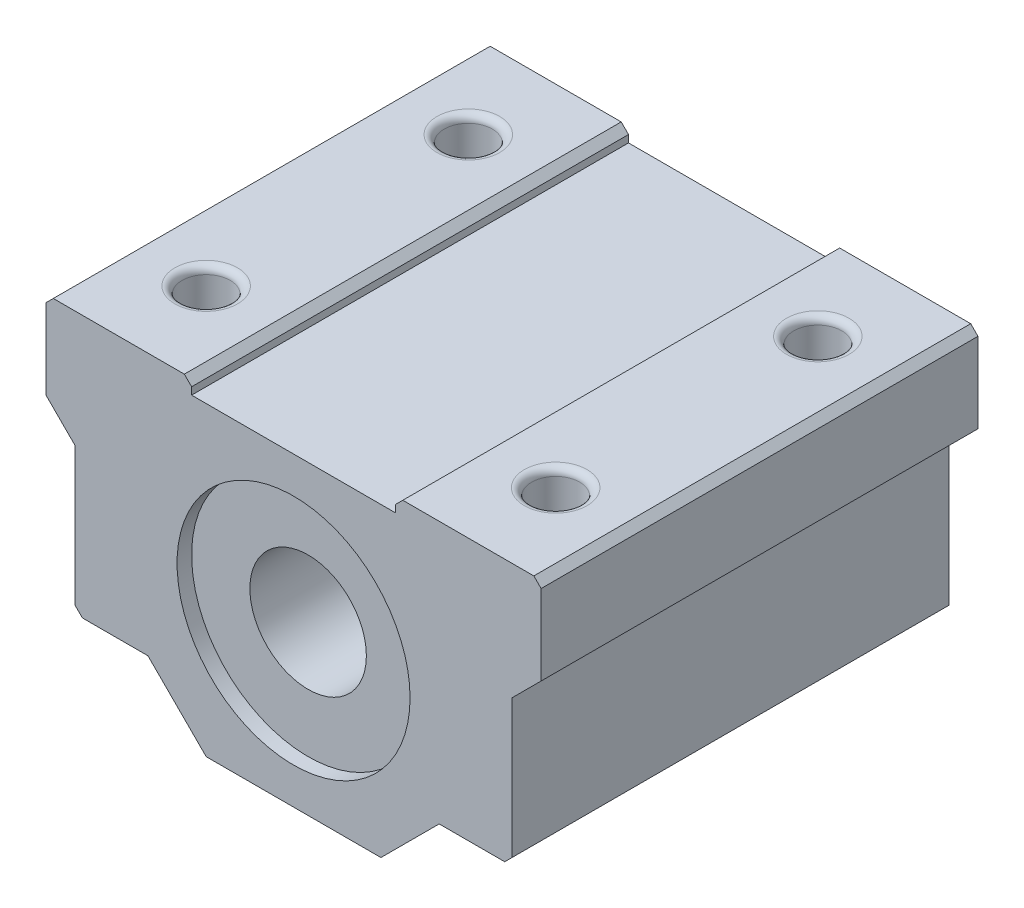
ISO-10303-21;
HEADER;
FILE_DESCRIPTION(('STEP AP214'),'2;1');
FILE_NAME('part.step','',(''),(''),'','','');
FILE_SCHEMA(('AUTOMOTIVE_DESIGN { 1 0 10303 214 1 1 1 1 }'));
ENDSEC;
DATA;
#1=APPLICATION_CONTEXT('core data for automotive mechanical design processes');
#2=APPLICATION_PROTOCOL_DEFINITION('international standard','automotive_design',2000,#1);
#3=PRODUCT_CONTEXT('',#1,'mechanical');
#4=PRODUCT('Part','Part','',(#3));
#5=PRODUCT_RELATED_PRODUCT_CATEGORY('part','',(#4));
#6=PRODUCT_DEFINITION_FORMATION('','',#4);
#7=PRODUCT_DEFINITION_CONTEXT('part definition',#1,'design');
#8=PRODUCT_DEFINITION('design','',#6,#7);
#9=PRODUCT_DEFINITION_SHAPE('','',#8);
#10=(LENGTH_UNIT() NAMED_UNIT(*) SI_UNIT(.MILLI.,.METRE.));
#11=(NAMED_UNIT(*) PLANE_ANGLE_UNIT() SI_UNIT($,.RADIAN.));
#12=(NAMED_UNIT(*) SI_UNIT($,.STERADIAN.) SOLID_ANGLE_UNIT());
#13=UNCERTAINTY_MEASURE_WITH_UNIT(LENGTH_MEASURE(1.E-05),#10,'distance_accuracy_value','');
#14=(GEOMETRIC_REPRESENTATION_CONTEXT(3) GLOBAL_UNCERTAINTY_ASSIGNED_CONTEXT((#13)) GLOBAL_UNIT_ASSIGNED_CONTEXT((#10,
#11,#12)) REPRESENTATION_CONTEXT('',''));
#15=CARTESIAN_POINT('',(0.,0.,0.));
#16=DIRECTION('',(0.,0.,1.));
#17=DIRECTION('',(1.,0.,0.));
#18=AXIS2_PLACEMENT_3D('',#15,#16,#17);
#19=CARTESIAN_POINT('',(0.,0.,15.));
#20=DIRECTION('',(0.,0.,-1.));
#21=DIRECTION('',(-1.,0.,0.));
#22=AXIS2_PLACEMENT_3D('',#19,#20,#21);
#23=CYLINDRICAL_SURFACE('',#22,8.);
#24=CARTESIAN_POINT('',(0.,0.,-15.));
#25=DIRECTION('',(0.,0.,1.));
#26=DIRECTION('',(1.,0.,0.));
#27=AXIS2_PLACEMENT_3D('',#24,#25,#26);
#28=CIRCLE('',#27,8.);
#29=CARTESIAN_POINT('',(8.,0.,-15.));
#30=VERTEX_POINT('',#29);
#31=EDGE_CURVE('E438',#30,#30,#28,.T.);
#32=ORIENTED_EDGE('',*,*,#31,.F.);
#33=EDGE_LOOP('',(#32));
#34=FACE_BOUND('',#33,.T.);
#35=CARTESIAN_POINT('',(0.,0.,-14.));
#36=DIRECTION('',(0.,0.,1.));
#37=DIRECTION('',(1.,0.,0.));
#38=AXIS2_PLACEMENT_3D('',#35,#36,#37);
#39=CIRCLE('',#38,8.);
#40=CARTESIAN_POINT('',(8.,0.,-14.));
#41=VERTEX_POINT('',#40);
#42=EDGE_CURVE('E775',#41,#41,#39,.T.);
#43=ORIENTED_EDGE('',*,*,#42,.T.);
#44=EDGE_LOOP('',(#43));
#45=FACE_BOUND('',#44,.T.);
#46=ADVANCED_FACE('F47',(#34,#45),#23,.F.);
#47=CARTESIAN_POINT('',(0.,0.,15.));
#48=DIRECTION('',(0.,0.,-1.));
#49=DIRECTION('',(-1.,0.,0.));
#50=AXIS2_PLACEMENT_3D('',#47,#48,#49);
#51=PLANE('',#50);
#52=DIRECTION('',(1.,0.,0.));
#53=VECTOR('',#52,1.);
#54=CARTESIAN_POINT('',(10.,-6.5,15.));
#55=LINE('',#54,#53);
#56=CARTESIAN_POINT('',(10.,-6.5,15.));
#57=VERTEX_POINT('',#56);
#58=CARTESIAN_POINT('',(14.5,-6.5,15.));
#59=VERTEX_POINT('',#58);
#60=EDGE_CURVE('E456',#57,#59,#55,.T.);
#61=ORIENTED_EDGE('',*,*,#60,.T.);
#62=DIRECTION('',(-0.707106781186548,-0.707106781186548,0.));
#63=VECTOR('',#62,1.);
#64=CARTESIAN_POINT('',(15.,-6.,15.));
#65=LINE('',#64,#63);
#66=CARTESIAN_POINT('',(15.,-6.,15.));
#67=VERTEX_POINT('',#66);
#68=EDGE_CURVE('E281',#59,#67,#65,.F.);
#69=ORIENTED_EDGE('',*,*,#68,.T.);
#70=DIRECTION('',(0.,1.,0.));
#71=VECTOR('',#70,1.);
#72=CARTESIAN_POINT('',(15.,-6.5,15.));
#73=LINE('',#72,#71);
#74=CARTESIAN_POINT('',(15.,3.5,15.));
#75=VERTEX_POINT('',#74);
#76=EDGE_CURVE('E458',#67,#75,#73,.T.);
#77=ORIENTED_EDGE('',*,*,#76,.T.);
#78=DIRECTION('',(0.707106781186547,0.707106781186547,0.));
#79=VECTOR('',#78,1.);
#80=CARTESIAN_POINT('',(15.,3.5,15.));
#81=LINE('',#80,#79);
#82=CARTESIAN_POINT('',(17.,5.5,15.));
#83=VERTEX_POINT('',#82);
#84=EDGE_CURVE('E460',#75,#83,#81,.T.);
#85=ORIENTED_EDGE('',*,*,#84,.T.);
#86=DIRECTION('',(0.,1.,0.));
#87=VECTOR('',#86,1.);
#88=CARTESIAN_POINT('',(17.,5.5,15.));
#89=LINE('',#88,#87);
#90=CARTESIAN_POINT('',(17.,11.,15.));
#91=VERTEX_POINT('',#90);
#92=EDGE_CURVE('E317',#83,#91,#89,.T.);
#93=ORIENTED_EDGE('',*,*,#92,.T.);
#94=DIRECTION('',(0.707106781186543,-0.707106781186552,0.));
#95=VECTOR('',#94,1.);
#96=CARTESIAN_POINT('',(16.5,11.5,15.));
#97=LINE('',#96,#95);
#98=CARTESIAN_POINT('',(16.5,11.5,15.));
#99=VERTEX_POINT('',#98);
#100=EDGE_CURVE('E273',#91,#99,#97,.F.);
#101=ORIENTED_EDGE('',*,*,#100,.T.);
#102=DIRECTION('',(-1.,0.,0.));
#103=VECTOR('',#102,1.);
#104=CARTESIAN_POINT('',(7.,11.5,15.));
#105=LINE('',#104,#103);
#106=CARTESIAN_POINT('',(7.5,11.5,15.));
#107=VERTEX_POINT('',#106);
#108=EDGE_CURVE('E307',#99,#107,#105,.T.);
#109=ORIENTED_EDGE('',*,*,#108,.T.);
#110=DIRECTION('',(0.707106781186548,0.707106781186548,0.));
#111=VECTOR('',#110,1.);
#112=CARTESIAN_POINT('',(7.,11.,15.));
#113=LINE('',#112,#111);
#114=CARTESIAN_POINT('',(7.,11.,15.));
#115=VERTEX_POINT('',#114);
#116=EDGE_CURVE('E275',#107,#115,#113,.F.);
#117=ORIENTED_EDGE('',*,*,#116,.T.);
#118=DIRECTION('',(0.,-1.,0.));
#119=VECTOR('',#118,1.);
#120=CARTESIAN_POINT('',(7.,10.5,15.));
#121=LINE('',#120,#119);
#122=CARTESIAN_POINT('',(7.,10.5,15.));
#123=VERTEX_POINT('',#122);
#124=EDGE_CURVE('E316',#115,#123,#121,.T.);
#125=ORIENTED_EDGE('',*,*,#124,.T.);
#126=DIRECTION('',(-1.,0.,0.));
#127=VECTOR('',#126,1.);
#128=CARTESIAN_POINT('',(-7.,10.5,15.));
#129=LINE('',#128,#127);
#130=CARTESIAN_POINT('',(-7.,10.5,15.));
#131=VERTEX_POINT('',#130);
#132=EDGE_CURVE('E464',#123,#131,#129,.T.);
#133=ORIENTED_EDGE('',*,*,#132,.T.);
#134=DIRECTION('',(0.,1.,0.));
#135=VECTOR('',#134,1.);
#136=CARTESIAN_POINT('',(-7.,10.5,15.));
#137=LINE('',#136,#135);
#138=CARTESIAN_POINT('',(-7.,11.,15.));
#139=VERTEX_POINT('',#138);
#140=EDGE_CURVE('E466',#131,#139,#137,.T.);
#141=ORIENTED_EDGE('',*,*,#140,.T.);
#142=DIRECTION('',(0.707106781186548,-0.707106781186548,0.));
#143=VECTOR('',#142,1.);
#144=CARTESIAN_POINT('',(-7.5,11.5,15.));
#145=LINE('',#144,#143);
#146=CARTESIAN_POINT('',(-7.5,11.5,15.));
#147=VERTEX_POINT('',#146);
#148=EDGE_CURVE('E69',#139,#147,#145,.F.);
#149=ORIENTED_EDGE('',*,*,#148,.T.);
#150=DIRECTION('',(-1.,0.,0.));
#151=VECTOR('',#150,1.);
#152=CARTESIAN_POINT('',(-17.,11.5,15.));
#153=LINE('',#152,#151);
#154=CARTESIAN_POINT('',(-16.5,11.5,15.));
#155=VERTEX_POINT('',#154);
#156=EDGE_CURVE('E348',#147,#155,#153,.T.);
#157=ORIENTED_EDGE('',*,*,#156,.T.);
#158=DIRECTION('',(0.707106781186548,0.707106781186548,0.));
#159=VECTOR('',#158,1.);
#160=CARTESIAN_POINT('',(-17.,11.,15.));
#161=LINE('',#160,#159);
#162=CARTESIAN_POINT('',(-17.,11.,15.));
#163=VERTEX_POINT('',#162);
#164=EDGE_CURVE('E204',#155,#163,#161,.F.);
#165=ORIENTED_EDGE('',*,*,#164,.T.);
#166=DIRECTION('',(0.,-1.,0.));
#167=VECTOR('',#166,1.);
#168=CARTESIAN_POINT('',(-17.,5.5,15.));
#169=LINE('',#168,#167);
#170=CARTESIAN_POINT('',(-17.,5.5,15.));
#171=VERTEX_POINT('',#170);
#172=EDGE_CURVE('E195',#163,#171,#169,.T.);
#173=ORIENTED_EDGE('',*,*,#172,.T.);
#174=DIRECTION('',(0.707106781186547,-0.707106781186547,0.));
#175=VECTOR('',#174,1.);
#176=CARTESIAN_POINT('',(-15.,3.5,15.));
#177=LINE('',#176,#175);
#178=CARTESIAN_POINT('',(-15.,3.5,15.));
#179=VERTEX_POINT('',#178);
#180=EDGE_CURVE('E201',#171,#179,#177,.T.);
#181=ORIENTED_EDGE('',*,*,#180,.T.);
#182=DIRECTION('',(0.,-1.,0.));
#183=VECTOR('',#182,1.);
#184=CARTESIAN_POINT('',(-15.,-6.5,15.));
#185=LINE('',#184,#183);
#186=CARTESIAN_POINT('',(-15.,-6.,15.));
#187=VERTEX_POINT('',#186);
#188=EDGE_CURVE('E218',#179,#187,#185,.T.);
#189=ORIENTED_EDGE('',*,*,#188,.T.);
#190=DIRECTION('',(-0.707106781186548,0.707106781186548,0.));
#191=VECTOR('',#190,1.);
#192=CARTESIAN_POINT('',(-14.5,-6.5,15.));
#193=LINE('',#192,#191);
#194=CARTESIAN_POINT('',(-14.5,-6.5,15.));
#195=VERTEX_POINT('',#194);
#196=EDGE_CURVE('E279',#187,#195,#193,.F.);
#197=ORIENTED_EDGE('',*,*,#196,.T.);
#198=DIRECTION('',(1.,0.,0.));
#199=VECTOR('',#198,1.);
#200=CARTESIAN_POINT('',(-10.,-6.5,15.));
#201=LINE('',#200,#199);
#202=CARTESIAN_POINT('',(-10.,-6.5,15.));
#203=VERTEX_POINT('',#202);
#204=EDGE_CURVE('E449',#195,#203,#201,.T.);
#205=ORIENTED_EDGE('',*,*,#204,.T.);
#206=DIRECTION('',(0.707106781186548,-0.707106781186548,0.));
#207=VECTOR('',#206,1.);
#208=CARTESIAN_POINT('',(-6.,-10.5,15.));
#209=LINE('',#208,#207);
#210=CARTESIAN_POINT('',(-6.,-10.5,15.));
#211=VERTEX_POINT('',#210);
#212=EDGE_CURVE('E372',#203,#211,#209,.T.);
#213=ORIENTED_EDGE('',*,*,#212,.T.);
#214=DIRECTION('',(1.,0.,0.));
#215=VECTOR('',#214,1.);
#216=CARTESIAN_POINT('',(-6.,-10.5,15.));
#217=LINE('',#216,#215);
#218=CARTESIAN_POINT('',(6.,-10.5,15.));
#219=VERTEX_POINT('',#218);
#220=EDGE_CURVE('E452',#211,#219,#217,.T.);
#221=ORIENTED_EDGE('',*,*,#220,.T.);
#222=DIRECTION('',(0.707106781186548,0.707106781186547,0.));
#223=VECTOR('',#222,1.);
#224=CARTESIAN_POINT('',(6.,-10.5,15.));
#225=LINE('',#224,#223);
#226=EDGE_CURVE('E454',#219,#57,#225,.T.);
#227=ORIENTED_EDGE('',*,*,#226,.T.);
#228=EDGE_LOOP('',(#61,#69,#77,#85,#93,#101,#109,#117,#125,#133,#141,#149,#157,#165,#173,#181,
#189,#197,#205,#213,#221,#227));
#229=FACE_BOUND('',#228,.T.);
#230=CARTESIAN_POINT('',(0.,0.,15.));
#231=DIRECTION('',(0.,0.,1.));
#232=DIRECTION('',(1.,0.,0.));
#233=AXIS2_PLACEMENT_3D('',#230,#231,#232);
#234=CIRCLE('',#233,8.);
#235=CARTESIAN_POINT('',(8.,0.,15.));
#236=VERTEX_POINT('',#235);
#237=EDGE_CURVE('E437',#236,#236,#234,.T.);
#238=ORIENTED_EDGE('',*,*,#237,.F.);
#239=EDGE_LOOP('',(#238));
#240=FACE_BOUND('',#239,.T.);
#241=ADVANCED_FACE('F198',(#229,#240),#51,.F.);
#242=CARTESIAN_POINT('',(0.,0.,-15.));
#243=DIRECTION('',(0.,0.,-1.));
#244=DIRECTION('',(-1.,0.,0.));
#245=AXIS2_PLACEMENT_3D('',#242,#243,#244);
#246=PLANE('',#245);
#247=DIRECTION('',(0.,1.,0.));
#248=VECTOR('',#247,1.);
#249=CARTESIAN_POINT('',(15.,-6.5,-15.));
#250=LINE('',#249,#248);
#251=CARTESIAN_POINT('',(15.,-6.,-15.));
#252=VERTEX_POINT('',#251);
#253=CARTESIAN_POINT('',(15.,3.5,-15.));
#254=VERTEX_POINT('',#253);
#255=EDGE_CURVE('E391',#252,#254,#250,.T.);
#256=ORIENTED_EDGE('',*,*,#255,.F.);
#257=DIRECTION('',(0.707106781186548,0.707106781186548,0.));
#258=VECTOR('',#257,1.);
#259=CARTESIAN_POINT('',(10.5,-10.5,-15.));
#260=LINE('',#259,#258);
#261=CARTESIAN_POINT('',(14.5,-6.5,-15.));
#262=VERTEX_POINT('',#261);
#263=EDGE_CURVE('E269',#252,#262,#260,.F.);
#264=ORIENTED_EDGE('',*,*,#263,.T.);
#265=DIRECTION('',(1.,0.,0.));
#266=VECTOR('',#265,1.);
#267=CARTESIAN_POINT('',(10.,-6.5,-15.));
#268=LINE('',#267,#266);
#269=CARTESIAN_POINT('',(10.,-6.5,-15.));
#270=VERTEX_POINT('',#269);
#271=EDGE_CURVE('E388',#270,#262,#268,.T.);
#272=ORIENTED_EDGE('',*,*,#271,.F.);
#273=DIRECTION('',(0.707106781186548,0.707106781186547,0.));
#274=VECTOR('',#273,1.);
#275=CARTESIAN_POINT('',(6.,-10.5,-15.));
#276=LINE('',#275,#274);
#277=CARTESIAN_POINT('',(6.,-10.5,-15.));
#278=VERTEX_POINT('',#277);
#279=EDGE_CURVE('E381',#278,#270,#276,.T.);
#280=ORIENTED_EDGE('',*,*,#279,.F.);
#281=DIRECTION('',(1.,0.,0.));
#282=VECTOR('',#281,1.);
#283=CARTESIAN_POINT('',(-6.,-10.5,-15.));
#284=LINE('',#283,#282);
#285=CARTESIAN_POINT('',(-6.,-10.5,-15.));
#286=VERTEX_POINT('',#285);
#287=EDGE_CURVE('E379',#286,#278,#284,.T.);
#288=ORIENTED_EDGE('',*,*,#287,.F.);
#289=DIRECTION('',(0.707106781186548,-0.707106781186548,0.));
#290=VECTOR('',#289,1.);
#291=CARTESIAN_POINT('',(-6.,-10.5,-15.));
#292=LINE('',#291,#290);
#293=CARTESIAN_POINT('',(-10.,-6.5,-15.));
#294=VERTEX_POINT('',#293);
#295=EDGE_CURVE('E371',#294,#286,#292,.T.);
#296=ORIENTED_EDGE('',*,*,#295,.F.);
#297=DIRECTION('',(1.,0.,0.));
#298=VECTOR('',#297,1.);
#299=CARTESIAN_POINT('',(-10.,-6.5,-15.));
#300=LINE('',#299,#298);
#301=CARTESIAN_POINT('',(-14.5,-6.5,-15.));
#302=VERTEX_POINT('',#301);
#303=EDGE_CURVE('E377',#302,#294,#300,.T.);
#304=ORIENTED_EDGE('',*,*,#303,.F.);
#305=DIRECTION('',(0.707106781186548,-0.707106781186548,0.));
#306=VECTOR('',#305,1.);
#307=CARTESIAN_POINT('',(-10.5,-10.5,-15.));
#308=LINE('',#307,#306);
#309=CARTESIAN_POINT('',(-15.,-6.,-15.));
#310=VERTEX_POINT('',#309);
#311=EDGE_CURVE('E267',#302,#310,#308,.F.);
#312=ORIENTED_EDGE('',*,*,#311,.T.);
#313=DIRECTION('',(0.,-1.,0.));
#314=VECTOR('',#313,1.);
#315=CARTESIAN_POINT('',(-15.,-6.5,-15.));
#316=LINE('',#315,#314);
#317=CARTESIAN_POINT('',(-15.,3.5,-15.));
#318=VERTEX_POINT('',#317);
#319=EDGE_CURVE('E383',#318,#310,#316,.T.);
#320=ORIENTED_EDGE('',*,*,#319,.F.);
#321=DIRECTION('',(0.707106781186547,-0.707106781186547,0.));
#322=VECTOR('',#321,1.);
#323=CARTESIAN_POINT('',(-15.,3.5,-15.));
#324=LINE('',#323,#322);
#325=CARTESIAN_POINT('',(-17.,5.5,-15.));
#326=VERTEX_POINT('',#325);
#327=EDGE_CURVE('E440',#326,#318,#324,.T.);
#328=ORIENTED_EDGE('',*,*,#327,.F.);
#329=DIRECTION('',(0.,-1.,0.));
#330=VECTOR('',#329,1.);
#331=CARTESIAN_POINT('',(-17.,5.5,-15.));
#332=LINE('',#331,#330);
#333=CARTESIAN_POINT('',(-17.,11.,-15.));
#334=VERTEX_POINT('',#333);
#335=EDGE_CURVE('E222',#334,#326,#332,.T.);
#336=ORIENTED_EDGE('',*,*,#335,.F.);
#337=DIRECTION('',(-0.707106781186548,-0.707106781186548,0.));
#338=VECTOR('',#337,1.);
#339=CARTESIAN_POINT('',(-14.,14.,-15.));
#340=LINE('',#339,#338);
#341=CARTESIAN_POINT('',(-16.5,11.5,-15.));
#342=VERTEX_POINT('',#341);
#343=EDGE_CURVE('E265',#334,#342,#340,.F.);
#344=ORIENTED_EDGE('',*,*,#343,.T.);
#345=DIRECTION('',(-1.,0.,0.));
#346=VECTOR('',#345,1.);
#347=CARTESIAN_POINT('',(-17.,11.5,-15.));
#348=LINE('',#347,#346);
#349=CARTESIAN_POINT('',(-7.5,11.5,-15.));
#350=VERTEX_POINT('',#349);
#351=EDGE_CURVE('E209',#350,#342,#348,.T.);
#352=ORIENTED_EDGE('',*,*,#351,.F.);
#353=DIRECTION('',(-0.707106781186548,0.707106781186548,0.));
#354=VECTOR('',#353,1.);
#355=CARTESIAN_POINT('',(2.,2.,-15.));
#356=LINE('',#355,#354);
#357=CARTESIAN_POINT('',(-7.,11.,-15.));
#358=VERTEX_POINT('',#357);
#359=EDGE_CURVE('E263',#350,#358,#356,.F.);
#360=ORIENTED_EDGE('',*,*,#359,.T.);
#361=DIRECTION('',(0.,1.,0.));
#362=VECTOR('',#361,1.);
#363=CARTESIAN_POINT('',(-7.,10.5,-15.));
#364=LINE('',#363,#362);
#365=CARTESIAN_POINT('',(-7.,10.5,-15.));
#366=VERTEX_POINT('',#365);
#367=EDGE_CURVE('E335',#366,#358,#364,.T.);
#368=ORIENTED_EDGE('',*,*,#367,.F.);
#369=DIRECTION('',(-1.,0.,0.));
#370=VECTOR('',#369,1.);
#371=CARTESIAN_POINT('',(-7.,10.5,-15.));
#372=LINE('',#371,#370);
#373=CARTESIAN_POINT('',(7.,10.5,-15.));
#374=VERTEX_POINT('',#373);
#375=EDGE_CURVE('E333',#374,#366,#372,.T.);
#376=ORIENTED_EDGE('',*,*,#375,.F.);
#377=DIRECTION('',(0.,-1.,0.));
#378=VECTOR('',#377,1.);
#379=CARTESIAN_POINT('',(7.,10.5,-15.));
#380=LINE('',#379,#378);
#381=CARTESIAN_POINT('',(7.,11.,-15.));
#382=VERTEX_POINT('',#381);
#383=EDGE_CURVE('E325',#382,#374,#380,.T.);
#384=ORIENTED_EDGE('',*,*,#383,.F.);
#385=DIRECTION('',(-0.707106781186548,-0.707106781186548,0.));
#386=VECTOR('',#385,1.);
#387=CARTESIAN_POINT('',(-2.,2.,-15.));
#388=LINE('',#387,#386);
#389=CARTESIAN_POINT('',(7.5,11.5,-15.));
#390=VERTEX_POINT('',#389);
#391=EDGE_CURVE('E261',#382,#390,#388,.F.);
#392=ORIENTED_EDGE('',*,*,#391,.T.);
#393=DIRECTION('',(-1.,0.,0.));
#394=VECTOR('',#393,1.);
#395=CARTESIAN_POINT('',(7.,11.5,-15.));
#396=LINE('',#395,#394);
#397=CARTESIAN_POINT('',(16.5,11.5,-15.));
#398=VERTEX_POINT('',#397);
#399=EDGE_CURVE('E310',#398,#390,#396,.T.);
#400=ORIENTED_EDGE('',*,*,#399,.F.);
#401=DIRECTION('',(-0.707106781186543,0.707106781186552,0.));
#402=VECTOR('',#401,1.);
#403=CARTESIAN_POINT('',(14.0000000000001,13.9999999999999,-15.));
#404=LINE('',#403,#402);
#405=CARTESIAN_POINT('',(17.,11.,-15.));
#406=VERTEX_POINT('',#405);
#407=EDGE_CURVE('E259',#398,#406,#404,.F.);
#408=ORIENTED_EDGE('',*,*,#407,.T.);
#409=DIRECTION('',(0.,1.,0.));
#410=VECTOR('',#409,1.);
#411=CARTESIAN_POINT('',(17.,5.5,-15.));
#412=LINE('',#411,#410);
#413=CARTESIAN_POINT('',(17.,5.5,-15.));
#414=VERTEX_POINT('',#413);
#415=EDGE_CURVE('E337',#414,#406,#412,.T.);
#416=ORIENTED_EDGE('',*,*,#415,.F.);
#417=DIRECTION('',(0.707106781186547,0.707106781186547,0.));
#418=VECTOR('',#417,1.);
#419=CARTESIAN_POINT('',(15.,3.5,-15.));
#420=LINE('',#419,#418);
#421=EDGE_CURVE('E393',#254,#414,#420,.T.);
#422=ORIENTED_EDGE('',*,*,#421,.F.);
#423=EDGE_LOOP('',(#256,#264,#272,#280,#288,#296,#304,#312,#320,#328,#336,#344,#352,#360,#368,
#376,#384,#392,#400,#408,#416,#422));
#424=FACE_BOUND('',#423,.T.);
#425=ORIENTED_EDGE('',*,*,#31,.T.);
#426=EDGE_LOOP('',(#425));
#427=FACE_BOUND('',#426,.T.);
#428=ADVANCED_FACE('F330',(#424,#427),#246,.T.);
#429=CARTESIAN_POINT('',(-17.,5.5,15.));
#430=DIRECTION('',(1.,0.,0.));
#431=DIRECTION('',(0.,0.,-1.));
#432=AXIS2_PLACEMENT_3D('',#429,#430,#431);
#433=PLANE('',#432);
#434=ORIENTED_EDGE('',*,*,#172,.F.);
#435=DIRECTION('',(0.,0.,-1.));
#436=VECTOR('',#435,1.);
#437=CARTESIAN_POINT('',(-17.,11.,15.));
#438=LINE('',#437,#436);
#439=EDGE_CURVE('E288',#163,#334,#438,.T.);
#440=ORIENTED_EDGE('',*,*,#439,.T.);
#441=ORIENTED_EDGE('',*,*,#335,.T.);
#442=DIRECTION('',(0.,0.,-1.));
#443=VECTOR('',#442,1.);
#444=CARTESIAN_POINT('',(-17.,5.5,15.));
#445=LINE('',#444,#443);
#446=EDGE_CURVE('E214',#171,#326,#445,.T.);
#447=ORIENTED_EDGE('',*,*,#446,.F.);
#448=EDGE_LOOP('',(#434,#440,#441,#447));
#449=FACE_BOUND('',#448,.T.);
#450=ADVANCED_FACE('F220',(#449),#433,.F.);
#451=CARTESIAN_POINT('',(-15.,3.5,15.));
#452=DIRECTION('',(0.707106781186547,0.707106781186547,0.));
#453=DIRECTION('',(-0.707106781186548,0.707106781186548,0.));
#454=AXIS2_PLACEMENT_3D('',#451,#452,#453);
#455=PLANE('',#454);
#456=ORIENTED_EDGE('',*,*,#327,.T.);
#457=DIRECTION('',(0.,0.,-1.));
#458=VECTOR('',#457,1.);
#459=CARTESIAN_POINT('',(-15.,3.5,15.));
#460=LINE('',#459,#458);
#461=EDGE_CURVE('E216',#179,#318,#460,.T.);
#462=ORIENTED_EDGE('',*,*,#461,.F.);
#463=ORIENTED_EDGE('',*,*,#180,.F.);
#464=ORIENTED_EDGE('',*,*,#446,.T.);
#465=EDGE_LOOP('',(#456,#462,#463,#464));
#466=FACE_BOUND('',#465,.T.);
#467=ADVANCED_FACE('F213',(#466),#455,.F.);
#468=CARTESIAN_POINT('',(-15.,-6.5,15.));
#469=DIRECTION('',(1.,0.,0.));
#470=DIRECTION('',(0.,0.,-1.));
#471=AXIS2_PLACEMENT_3D('',#468,#469,#470);
#472=PLANE('',#471);
#473=ORIENTED_EDGE('',*,*,#319,.T.);
#474=DIRECTION('',(0.,0.,1.));
#475=VECTOR('',#474,1.);
#476=CARTESIAN_POINT('',(-15.,-6.,15.));
#477=LINE('',#476,#475);
#478=EDGE_CURVE('E286',#310,#187,#477,.T.);
#479=ORIENTED_EDGE('',*,*,#478,.T.);
#480=ORIENTED_EDGE('',*,*,#188,.F.);
#481=ORIENTED_EDGE('',*,*,#461,.T.);
#482=EDGE_LOOP('',(#473,#479,#480,#481));
#483=FACE_BOUND('',#482,.T.);
#484=ADVANCED_FACE('F473',(#483),#472,.F.);
#485=CARTESIAN_POINT('',(-10.,-6.5,15.));
#486=DIRECTION('',(0.,1.,0.));
#487=DIRECTION('',(0.,0.,1.));
#488=AXIS2_PLACEMENT_3D('',#485,#486,#487);
#489=PLANE('',#488);
#490=CARTESIAN_POINT('',(-12.,-6.5,9.));
#491=DIRECTION('',(0.,1.,0.));
#492=DIRECTION('',(0.,0.,1.));
#493=AXIS2_PLACEMENT_3D('',#490,#491,#492);
#494=CIRCLE('',#493,1.65);
#495=CARTESIAN_POINT('',(-12.,-6.5,10.65));
#496=VERTEX_POINT('',#495);
#497=EDGE_CURVE('E780',#496,#496,#494,.T.);
#498=ORIENTED_EDGE('',*,*,#497,.T.);
#499=EDGE_LOOP('',(#498));
#500=FACE_BOUND('',#499,.T.);
#501=CARTESIAN_POINT('',(-12.,-6.5,-9.));
#502=DIRECTION('',(0.,1.,0.));
#503=DIRECTION('',(0.,0.,1.));
#504=AXIS2_PLACEMENT_3D('',#501,#502,#503);
#505=CIRCLE('',#504,1.65);
#506=CARTESIAN_POINT('',(-12.,-6.5,-7.35));
#507=VERTEX_POINT('',#506);
#508=EDGE_CURVE('E443',#507,#507,#505,.T.);
#509=ORIENTED_EDGE('',*,*,#508,.T.);
#510=EDGE_LOOP('',(#509));
#511=FACE_BOUND('',#510,.T.);
#512=ORIENTED_EDGE('',*,*,#204,.F.);
#513=DIRECTION('',(0.,0.,-1.));
#514=VECTOR('',#513,1.);
#515=CARTESIAN_POINT('',(-14.5,-6.5,15.));
#516=LINE('',#515,#514);
#517=EDGE_CURVE('E283',#195,#302,#516,.T.);
#518=ORIENTED_EDGE('',*,*,#517,.T.);
#519=ORIENTED_EDGE('',*,*,#303,.T.);
#520=DIRECTION('',(0.,0.,-1.));
#521=VECTOR('',#520,1.);
#522=CARTESIAN_POINT('',(-10.,-6.5,15.));
#523=LINE('',#522,#521);
#524=EDGE_CURVE('E229',#203,#294,#523,.T.);
#525=ORIENTED_EDGE('',*,*,#524,.F.);
#526=EDGE_LOOP('',(#512,#518,#519,#525));
#527=FACE_BOUND('',#526,.T.);
#528=ADVANCED_FACE('F478',(#500,#511,#527),#489,.F.);
#529=CARTESIAN_POINT('',(-6.,-10.5,15.));
#530=DIRECTION('',(0.707106781186548,0.707106781186548,0.));
#531=DIRECTION('',(-0.707106781186548,0.707106781186548,0.));
#532=AXIS2_PLACEMENT_3D('',#529,#530,#531);
#533=PLANE('',#532);
#534=ORIENTED_EDGE('',*,*,#295,.T.);
#535=DIRECTION('',(0.,0.,-1.));
#536=VECTOR('',#535,1.);
#537=CARTESIAN_POINT('',(-6.,-10.5,15.));
#538=LINE('',#537,#536);
#539=EDGE_CURVE('E362',#211,#286,#538,.T.);
#540=ORIENTED_EDGE('',*,*,#539,.F.);
#541=ORIENTED_EDGE('',*,*,#212,.F.);
#542=ORIENTED_EDGE('',*,*,#524,.T.);
#543=EDGE_LOOP('',(#534,#540,#541,#542));
#544=FACE_BOUND('',#543,.T.);
#545=ADVANCED_FACE('F369',(#544),#533,.F.);
#546=CARTESIAN_POINT('',(-6.,-10.5,15.));
#547=DIRECTION('',(0.,1.,0.));
#548=DIRECTION('',(0.,0.,1.));
#549=AXIS2_PLACEMENT_3D('',#546,#547,#548);
#550=PLANE('',#549);
#551=ORIENTED_EDGE('',*,*,#287,.T.);
#552=DIRECTION('',(0.,0.,-1.));
#553=VECTOR('',#552,1.);
#554=CARTESIAN_POINT('',(6.,-10.5,15.));
#555=LINE('',#554,#553);
#556=EDGE_CURVE('E359',#219,#278,#555,.T.);
#557=ORIENTED_EDGE('',*,*,#556,.F.);
#558=ORIENTED_EDGE('',*,*,#220,.F.);
#559=ORIENTED_EDGE('',*,*,#539,.T.);
#560=EDGE_LOOP('',(#551,#557,#558,#559));
#561=FACE_BOUND('',#560,.T.);
#562=ADVANCED_FACE('F487',(#561),#550,.F.);
#563=CARTESIAN_POINT('',(6.,-10.5,15.));
#564=DIRECTION('',(-0.707106781186547,0.707106781186548,0.));
#565=DIRECTION('',(-0.707106781186548,-0.707106781186547,0.));
#566=AXIS2_PLACEMENT_3D('',#563,#564,#565);
#567=PLANE('',#566);
#568=ORIENTED_EDGE('',*,*,#279,.T.);
#569=DIRECTION('',(0.,0.,-1.));
#570=VECTOR('',#569,1.);
#571=CARTESIAN_POINT('',(10.,-6.5,15.));
#572=LINE('',#571,#570);
#573=EDGE_CURVE('E356',#57,#270,#572,.T.);
#574=ORIENTED_EDGE('',*,*,#573,.F.);
#575=ORIENTED_EDGE('',*,*,#226,.F.);
#576=ORIENTED_EDGE('',*,*,#556,.T.);
#577=EDGE_LOOP('',(#568,#574,#575,#576));
#578=FACE_BOUND('',#577,.T.);
#579=ADVANCED_FACE('F563',(#578),#567,.F.);
#580=CARTESIAN_POINT('',(10.,-6.5,15.));
#581=DIRECTION('',(0.,1.,0.));
#582=DIRECTION('',(0.,0.,1.));
#583=AXIS2_PLACEMENT_3D('',#580,#581,#582);
#584=PLANE('',#583);
#585=CARTESIAN_POINT('',(12.,-6.5,9.));
#586=DIRECTION('',(0.,1.,0.));
#587=DIRECTION('',(0.,0.,1.));
#588=AXIS2_PLACEMENT_3D('',#585,#586,#587);
#589=CIRCLE('',#588,1.65);
#590=CARTESIAN_POINT('',(12.,-6.5,10.65));
#591=VERTEX_POINT('',#590);
#592=EDGE_CURVE('E784',#591,#591,#589,.T.);
#593=ORIENTED_EDGE('',*,*,#592,.T.);
#594=EDGE_LOOP('',(#593));
#595=FACE_BOUND('',#594,.T.);
#596=CARTESIAN_POINT('',(12.,-6.5,-9.));
#597=DIRECTION('',(0.,1.,0.));
#598=DIRECTION('',(0.,0.,1.));
#599=AXIS2_PLACEMENT_3D('',#596,#597,#598);
#600=CIRCLE('',#599,1.65);
#601=CARTESIAN_POINT('',(12.,-6.5,-7.35));
#602=VERTEX_POINT('',#601);
#603=EDGE_CURVE('E782',#602,#602,#600,.T.);
#604=ORIENTED_EDGE('',*,*,#603,.T.);
#605=EDGE_LOOP('',(#604));
#606=FACE_BOUND('',#605,.T.);
#607=ORIENTED_EDGE('',*,*,#271,.T.);
#608=DIRECTION('',(0.,0.,1.));
#609=VECTOR('',#608,1.);
#610=CARTESIAN_POINT('',(14.5,-6.5,15.));
#611=LINE('',#610,#609);
#612=EDGE_CURVE('E271',#262,#59,#611,.T.);
#613=ORIENTED_EDGE('',*,*,#612,.T.);
#614=ORIENTED_EDGE('',*,*,#60,.F.);
#615=ORIENTED_EDGE('',*,*,#573,.T.);
#616=EDGE_LOOP('',(#607,#613,#614,#615));
#617=FACE_BOUND('',#616,.T.);
#618=ADVANCED_FACE('F560',(#595,#606,#617),#584,.F.);
#619=CARTESIAN_POINT('',(15.,-6.5,15.));
#620=DIRECTION('',(-1.,0.,0.));
#621=DIRECTION('',(0.,0.,1.));
#622=AXIS2_PLACEMENT_3D('',#619,#620,#621);
#623=PLANE('',#622);
#624=ORIENTED_EDGE('',*,*,#76,.F.);
#625=DIRECTION('',(0.,0.,-1.));
#626=VECTOR('',#625,1.);
#627=CARTESIAN_POINT('',(15.,-6.,15.));
#628=LINE('',#627,#626);
#629=EDGE_CURVE('E256',#67,#252,#628,.T.);
#630=ORIENTED_EDGE('',*,*,#629,.T.);
#631=ORIENTED_EDGE('',*,*,#255,.T.);
#632=DIRECTION('',(0.,0.,-1.));
#633=VECTOR('',#632,1.);
#634=CARTESIAN_POINT('',(15.,3.5,15.));
#635=LINE('',#634,#633);
#636=EDGE_CURVE('E353',#75,#254,#635,.T.);
#637=ORIENTED_EDGE('',*,*,#636,.F.);
#638=EDGE_LOOP('',(#624,#630,#631,#637));
#639=FACE_BOUND('',#638,.T.);
#640=ADVANCED_FACE('F556',(#639),#623,.F.);
#641=CARTESIAN_POINT('',(15.,3.5,15.));
#642=DIRECTION('',(-0.707106781186547,0.707106781186547,0.));
#643=DIRECTION('',(-0.707106781186548,-0.707106781186548,0.));
#644=AXIS2_PLACEMENT_3D('',#641,#642,#643);
#645=PLANE('',#644);
#646=ORIENTED_EDGE('',*,*,#421,.T.);
#647=DIRECTION('',(0.,0.,-1.));
#648=VECTOR('',#647,1.);
#649=CARTESIAN_POINT('',(17.,5.5,15.));
#650=LINE('',#649,#648);
#651=EDGE_CURVE('E350',#83,#414,#650,.T.);
#652=ORIENTED_EDGE('',*,*,#651,.F.);
#653=ORIENTED_EDGE('',*,*,#84,.F.);
#654=ORIENTED_EDGE('',*,*,#636,.T.);
#655=EDGE_LOOP('',(#646,#652,#653,#654));
#656=FACE_BOUND('',#655,.T.);
#657=ADVANCED_FACE('F554',(#656),#645,.F.);
#658=CARTESIAN_POINT('',(17.,5.5,15.));
#659=DIRECTION('',(-1.,0.,0.));
#660=DIRECTION('',(0.,0.,1.));
#661=AXIS2_PLACEMENT_3D('',#658,#659,#660);
#662=PLANE('',#661);
#663=ORIENTED_EDGE('',*,*,#415,.T.);
#664=DIRECTION('',(0.,0.,1.));
#665=VECTOR('',#664,1.);
#666=CARTESIAN_POINT('',(17.,11.,15.));
#667=LINE('',#666,#665);
#668=EDGE_CURVE('E11',#406,#91,#667,.T.);
#669=ORIENTED_EDGE('',*,*,#668,.T.);
#670=ORIENTED_EDGE('',*,*,#92,.F.);
#671=ORIENTED_EDGE('',*,*,#651,.T.);
#672=EDGE_LOOP('',(#663,#669,#670,#671));
#673=FACE_BOUND('',#672,.T.);
#674=ADVANCED_FACE('F398',(#673),#662,.F.);
#675=CARTESIAN_POINT('',(7.,11.5,15.));
#676=DIRECTION('',(0.,-1.,0.));
#677=DIRECTION('',(0.,0.,-1.));
#678=AXIS2_PLACEMENT_3D('',#675,#676,#677);
#679=PLANE('',#678);
#680=CARTESIAN_POINT('',(12.,11.5,-9.));
#681=DIRECTION('',(0.,-1.,0.));
#682=DIRECTION('',(0.,0.,-1.));
#683=AXIS2_PLACEMENT_3D('',#680,#681,#682);
#684=CIRCLE('',#683,2.15);
#685=CARTESIAN_POINT('',(12.,11.5,-11.15));
#686=VERTEX_POINT('',#685);
#687=EDGE_CURVE('E238',#686,#686,#684,.T.);
#688=ORIENTED_EDGE('',*,*,#687,.T.);
#689=EDGE_LOOP('',(#688));
#690=FACE_BOUND('',#689,.T.);
#691=CARTESIAN_POINT('',(12.,11.5,9.));
#692=DIRECTION('',(0.,-1.,0.));
#693=DIRECTION('',(0.,0.,-1.));
#694=AXIS2_PLACEMENT_3D('',#691,#692,#693);
#695=CIRCLE('',#694,2.15);
#696=CARTESIAN_POINT('',(12.,11.5,6.85));
#697=VERTEX_POINT('',#696);
#698=EDGE_CURVE('E235',#697,#697,#695,.T.);
#699=ORIENTED_EDGE('',*,*,#698,.T.);
#700=EDGE_LOOP('',(#699));
#701=FACE_BOUND('',#700,.T.);
#702=ORIENTED_EDGE('',*,*,#399,.T.);
#703=DIRECTION('',(0.,0.,1.));
#704=VECTOR('',#703,1.);
#705=CARTESIAN_POINT('',(7.5,11.5,15.));
#706=LINE('',#705,#704);
#707=EDGE_CURVE('E55',#390,#107,#706,.T.);
#708=ORIENTED_EDGE('',*,*,#707,.T.);
#709=ORIENTED_EDGE('',*,*,#108,.F.);
#710=DIRECTION('',(0.,0.,-1.));
#711=VECTOR('',#710,1.);
#712=CARTESIAN_POINT('',(16.5,11.5,15.));
#713=LINE('',#712,#711);
#714=EDGE_CURVE('E299',#99,#398,#713,.T.);
#715=ORIENTED_EDGE('',*,*,#714,.T.);
#716=EDGE_LOOP('',(#702,#708,#709,#715));
#717=FACE_BOUND('',#716,.T.);
#718=ADVANCED_FACE('F306',(#690,#701,#717),#679,.F.);
#719=CARTESIAN_POINT('',(7.,10.5,15.));
#720=DIRECTION('',(1.,0.,0.));
#721=DIRECTION('',(0.,0.,-1.));
#722=AXIS2_PLACEMENT_3D('',#719,#720,#721);
#723=PLANE('',#722);
#724=ORIENTED_EDGE('',*,*,#124,.F.);
#725=DIRECTION('',(0.,0.,-1.));
#726=VECTOR('',#725,1.);
#727=CARTESIAN_POINT('',(7.,11.,15.));
#728=LINE('',#727,#726);
#729=EDGE_CURVE('E296',#115,#382,#728,.T.);
#730=ORIENTED_EDGE('',*,*,#729,.T.);
#731=ORIENTED_EDGE('',*,*,#383,.T.);
#732=DIRECTION('',(0.,0.,-1.));
#733=VECTOR('',#732,1.);
#734=CARTESIAN_POINT('',(7.,10.5,15.));
#735=LINE('',#734,#733);
#736=EDGE_CURVE('E347',#123,#374,#735,.T.);
#737=ORIENTED_EDGE('',*,*,#736,.F.);
#738=EDGE_LOOP('',(#724,#730,#731,#737));
#739=FACE_BOUND('',#738,.T.);
#740=ADVANCED_FACE('F323',(#739),#723,.F.);
#741=CARTESIAN_POINT('',(-7.,10.5,15.));
#742=DIRECTION('',(0.,-1.,0.));
#743=DIRECTION('',(0.,0.,-1.));
#744=AXIS2_PLACEMENT_3D('',#741,#742,#743);
#745=PLANE('',#744);
#746=ORIENTED_EDGE('',*,*,#375,.T.);
#747=DIRECTION('',(0.,0.,-1.));
#748=VECTOR('',#747,1.);
#749=CARTESIAN_POINT('',(-7.,10.5,15.));
#750=LINE('',#749,#748);
#751=EDGE_CURVE('E344',#131,#366,#750,.T.);
#752=ORIENTED_EDGE('',*,*,#751,.F.);
#753=ORIENTED_EDGE('',*,*,#132,.F.);
#754=ORIENTED_EDGE('',*,*,#736,.T.);
#755=EDGE_LOOP('',(#746,#752,#753,#754));
#756=FACE_BOUND('',#755,.T.);
#757=ADVANCED_FACE('F537',(#756),#745,.F.);
#758=CARTESIAN_POINT('',(-7.,10.5,15.));
#759=DIRECTION('',(-1.,0.,0.));
#760=DIRECTION('',(0.,0.,1.));
#761=AXIS2_PLACEMENT_3D('',#758,#759,#760);
#762=PLANE('',#761);
#763=ORIENTED_EDGE('',*,*,#367,.T.);
#764=DIRECTION('',(0.,0.,1.));
#765=VECTOR('',#764,1.);
#766=CARTESIAN_POINT('',(-7.,11.,15.));
#767=LINE('',#766,#765);
#768=EDGE_CURVE('E294',#358,#139,#767,.T.);
#769=ORIENTED_EDGE('',*,*,#768,.T.);
#770=ORIENTED_EDGE('',*,*,#140,.F.);
#771=ORIENTED_EDGE('',*,*,#751,.T.);
#772=EDGE_LOOP('',(#763,#769,#770,#771));
#773=FACE_BOUND('',#772,.T.);
#774=ADVANCED_FACE('F430',(#773),#762,.F.);
#775=CARTESIAN_POINT('',(-17.,11.5,15.));
#776=DIRECTION('',(0.,-1.,0.));
#777=DIRECTION('',(0.,0.,-1.));
#778=AXIS2_PLACEMENT_3D('',#775,#776,#777);
#779=PLANE('',#778);
#780=CARTESIAN_POINT('',(-12.,11.5,-9.));
#781=DIRECTION('',(0.,-1.,0.));
#782=DIRECTION('',(0.,0.,-1.));
#783=AXIS2_PLACEMENT_3D('',#780,#781,#782);
#784=CIRCLE('',#783,2.15);
#785=CARTESIAN_POINT('',(-12.,11.5,-11.15));
#786=VERTEX_POINT('',#785);
#787=EDGE_CURVE('E250',#786,#786,#784,.T.);
#788=ORIENTED_EDGE('',*,*,#787,.T.);
#789=EDGE_LOOP('',(#788));
#790=FACE_BOUND('',#789,.T.);
#791=CARTESIAN_POINT('',(-12.,11.5,9.));
#792=DIRECTION('',(0.,-1.,0.));
#793=DIRECTION('',(0.,0.,-1.));
#794=AXIS2_PLACEMENT_3D('',#791,#792,#793);
#795=CIRCLE('',#794,2.15);
#796=CARTESIAN_POINT('',(-12.,11.5,6.85));
#797=VERTEX_POINT('',#796);
#798=EDGE_CURVE('E247',#797,#797,#795,.T.);
#799=ORIENTED_EDGE('',*,*,#798,.T.);
#800=EDGE_LOOP('',(#799));
#801=FACE_BOUND('',#800,.T.);
#802=ORIENTED_EDGE('',*,*,#351,.T.);
#803=DIRECTION('',(0.,0.,1.));
#804=VECTOR('',#803,1.);
#805=CARTESIAN_POINT('',(-16.5,11.5,15.));
#806=LINE('',#805,#804);
#807=EDGE_CURVE('E62',#342,#155,#806,.T.);
#808=ORIENTED_EDGE('',*,*,#807,.T.);
#809=ORIENTED_EDGE('',*,*,#156,.F.);
#810=DIRECTION('',(0.,0.,-1.));
#811=VECTOR('',#810,1.);
#812=CARTESIAN_POINT('',(-7.5,11.5,15.));
#813=LINE('',#812,#811);
#814=EDGE_CURVE('E290',#147,#350,#813,.T.);
#815=ORIENTED_EDGE('',*,*,#814,.T.);
#816=EDGE_LOOP('',(#802,#808,#809,#815));
#817=FACE_BOUND('',#816,.T.);
#818=ADVANCED_FACE('F421',(#790,#801,#817),#779,.F.);
#819=CARTESIAN_POINT('',(0.,0.,14.));
#820=DIRECTION('',(0.,0.,1.));
#821=DIRECTION('',(1.,0.,0.));
#822=AXIS2_PLACEMENT_3D('',#819,#820,#821);
#823=CIRCLE('',#822,8.);
#824=CARTESIAN_POINT('',(8.,0.,14.));
#825=VERTEX_POINT('',#824);
#826=EDGE_CURVE('E224',#825,#825,#823,.T.);
#827=ORIENTED_EDGE('',*,*,#826,.F.);
#828=EDGE_LOOP('',(#827));
#829=FACE_BOUND('',#828,.T.);
#830=ORIENTED_EDGE('',*,*,#237,.T.);
#831=EDGE_LOOP('',(#830));
#832=FACE_BOUND('',#831,.T.);
#833=ADVANCED_FACE('F411',(#829,#832),#23,.F.);
#834=CARTESIAN_POINT('',(-12.,-10.5,-9.));
#835=DIRECTION('',(0.,1.,0.));
#836=DIRECTION('',(0.,0.,1.));
#837=AXIS2_PLACEMENT_3D('',#834,#835,#836);
#838=CYLINDRICAL_SURFACE('',#837,1.65);
#839=CARTESIAN_POINT('',(-12.,11.,-9.));
#840=DIRECTION('',(0.,-1.,0.));
#841=DIRECTION('',(0.,0.,-1.));
#842=AXIS2_PLACEMENT_3D('',#839,#840,#841);
#843=CIRCLE('',#842,1.65);
#844=CARTESIAN_POINT('',(-12.,11.,-10.65));
#845=VERTEX_POINT('',#844);
#846=EDGE_CURVE('E244',#845,#845,#843,.F.);
#847=ORIENTED_EDGE('',*,*,#846,.T.);
#848=EDGE_LOOP('',(#847));
#849=FACE_BOUND('',#848,.T.);
#850=ORIENTED_EDGE('',*,*,#508,.F.);
#851=EDGE_LOOP('',(#850));
#852=FACE_BOUND('',#851,.T.);
#853=ADVANCED_FACE('F420',(#849,#852),#838,.F.);
#854=CARTESIAN_POINT('',(-12.,-10.5,9.));
#855=DIRECTION('',(0.,1.,0.));
#856=DIRECTION('',(0.,0.,1.));
#857=AXIS2_PLACEMENT_3D('',#854,#855,#856);
#858=CYLINDRICAL_SURFACE('',#857,1.65);
#859=CARTESIAN_POINT('',(-12.,11.,9.));
#860=DIRECTION('',(0.,-1.,0.));
#861=DIRECTION('',(0.,0.,-1.));
#862=AXIS2_PLACEMENT_3D('',#859,#860,#861);
#863=CIRCLE('',#862,1.65);
#864=CARTESIAN_POINT('',(-12.,11.,7.35));
#865=VERTEX_POINT('',#864);
#866=EDGE_CURVE('E253',#865,#865,#863,.F.);
#867=ORIENTED_EDGE('',*,*,#866,.T.);
#868=EDGE_LOOP('',(#867));
#869=FACE_BOUND('',#868,.T.);
#870=ORIENTED_EDGE('',*,*,#497,.F.);
#871=EDGE_LOOP('',(#870));
#872=FACE_BOUND('',#871,.T.);
#873=ADVANCED_FACE('F427',(#869,#872),#858,.F.);
#874=CARTESIAN_POINT('',(12.,-10.5,-9.));
#875=DIRECTION('',(0.,1.,0.));
#876=DIRECTION('',(0.,0.,1.));
#877=AXIS2_PLACEMENT_3D('',#874,#875,#876);
#878=CYLINDRICAL_SURFACE('',#877,1.65);
#879=CARTESIAN_POINT('',(12.,11.,-9.));
#880=DIRECTION('',(0.,-1.,0.));
#881=DIRECTION('',(0.,0.,-1.));
#882=AXIS2_PLACEMENT_3D('',#879,#880,#881);
#883=CIRCLE('',#882,1.65);
#884=CARTESIAN_POINT('',(12.,11.,-10.65));
#885=VERTEX_POINT('',#884);
#886=EDGE_CURVE('E227',#885,#885,#883,.F.);
#887=ORIENTED_EDGE('',*,*,#886,.T.);
#888=EDGE_LOOP('',(#887));
#889=FACE_BOUND('',#888,.T.);
#890=ORIENTED_EDGE('',*,*,#603,.F.);
#891=EDGE_LOOP('',(#890));
#892=FACE_BOUND('',#891,.T.);
#893=ADVANCED_FACE('F639',(#889,#892),#878,.F.);
#894=CARTESIAN_POINT('',(12.,-10.5,9.));
#895=DIRECTION('',(0.,1.,0.));
#896=DIRECTION('',(0.,0.,1.));
#897=AXIS2_PLACEMENT_3D('',#894,#895,#896);
#898=CYLINDRICAL_SURFACE('',#897,1.65);
#899=CARTESIAN_POINT('',(12.,11.,9.));
#900=DIRECTION('',(0.,-1.,0.));
#901=DIRECTION('',(0.,0.,-1.));
#902=AXIS2_PLACEMENT_3D('',#899,#900,#901);
#903=CIRCLE('',#902,1.65);
#904=CARTESIAN_POINT('',(12.,11.,7.35));
#905=VERTEX_POINT('',#904);
#906=EDGE_CURVE('E241',#905,#905,#903,.F.);
#907=ORIENTED_EDGE('',*,*,#906,.T.);
#908=EDGE_LOOP('',(#907));
#909=FACE_BOUND('',#908,.T.);
#910=ORIENTED_EDGE('',*,*,#592,.F.);
#911=EDGE_LOOP('',(#910));
#912=FACE_BOUND('',#911,.T.);
#913=ADVANCED_FACE('F647',(#909,#912),#898,.F.);
#914=CARTESIAN_POINT('',(0.,0.,14.));
#915=DIRECTION('',(0.,0.,1.));
#916=DIRECTION('',(1.,0.,0.));
#917=AXIS2_PLACEMENT_3D('',#914,#915,#916);
#918=PLANE('',#917);
#919=ORIENTED_EDGE('',*,*,#826,.T.);
#920=EDGE_LOOP('',(#919));
#921=FACE_BOUND('',#920,.T.);
#922=CARTESIAN_POINT('',(0.,0.,14.));
#923=DIRECTION('',(0.,0.,1.));
#924=DIRECTION('',(1.,0.,0.));
#925=AXIS2_PLACEMENT_3D('',#922,#923,#924);
#926=CIRCLE('',#925,4.);
#927=CARTESIAN_POINT('',(4.,0.,14.));
#928=VERTEX_POINT('',#927);
#929=EDGE_CURVE('E769',#928,#928,#926,.T.);
#930=ORIENTED_EDGE('',*,*,#929,.F.);
#931=EDGE_LOOP('',(#930));
#932=FACE_BOUND('',#931,.T.);
#933=ADVANCED_FACE('F655',(#921,#932),#918,.T.);
#934=CARTESIAN_POINT('',(0.,0.,-14.));
#935=DIRECTION('',(0.,0.,1.));
#936=DIRECTION('',(1.,0.,0.));
#937=AXIS2_PLACEMENT_3D('',#934,#935,#936);
#938=PLANE('',#937);
#939=ORIENTED_EDGE('',*,*,#42,.F.);
#940=EDGE_LOOP('',(#939));
#941=FACE_BOUND('',#940,.T.);
#942=CARTESIAN_POINT('',(0.,0.,-14.));
#943=DIRECTION('',(0.,0.,1.));
#944=DIRECTION('',(1.,0.,0.));
#945=AXIS2_PLACEMENT_3D('',#942,#943,#944);
#946=CIRCLE('',#945,4.);
#947=CARTESIAN_POINT('',(4.,0.,-14.));
#948=VERTEX_POINT('',#947);
#949=EDGE_CURVE('E772',#948,#948,#946,.T.);
#950=ORIENTED_EDGE('',*,*,#949,.T.);
#951=EDGE_LOOP('',(#950));
#952=FACE_BOUND('',#951,.T.);
#953=ADVANCED_FACE('F667',(#941,#952),#938,.F.);
#954=CARTESIAN_POINT('',(0.,0.,14.));
#955=DIRECTION('',(0.,0.,-1.));
#956=DIRECTION('',(-1.,0.,0.));
#957=AXIS2_PLACEMENT_3D('',#954,#955,#956);
#958=CYLINDRICAL_SURFACE('',#957,4.);
#959=ORIENTED_EDGE('',*,*,#929,.T.);
#960=EDGE_LOOP('',(#959));
#961=FACE_BOUND('',#960,.T.);
#962=ORIENTED_EDGE('',*,*,#949,.F.);
#963=EDGE_LOOP('',(#962));
#964=FACE_BOUND('',#963,.T.);
#965=ADVANCED_FACE('F502',(#961,#964),#958,.F.);
#966=CARTESIAN_POINT('',(12.,11.,-9.));
#967=DIRECTION('',(0.,-1.,0.));
#968=DIRECTION('',(0.,0.,-1.));
#969=AXIS2_PLACEMENT_3D('',#966,#967,#968);
#970=TOROIDAL_SURFACE('',#969,2.15,0.5);
#971=ORIENTED_EDGE('',*,*,#687,.F.);
#972=EDGE_LOOP('',(#971));
#973=FACE_BOUND('',#972,.T.);
#974=ORIENTED_EDGE('',*,*,#886,.F.);
#975=EDGE_LOOP('',(#974));
#976=FACE_BOUND('',#975,.T.);
#977=ADVANCED_FACE('F498',(#973,#976),#970,.T.);
#978=CARTESIAN_POINT('',(12.,11.,9.));
#979=DIRECTION('',(0.,-1.,0.));
#980=DIRECTION('',(0.,0.,-1.));
#981=AXIS2_PLACEMENT_3D('',#978,#979,#980);
#982=TOROIDAL_SURFACE('',#981,2.15,0.5);
#983=ORIENTED_EDGE('',*,*,#698,.F.);
#984=EDGE_LOOP('',(#983));
#985=FACE_BOUND('',#984,.T.);
#986=ORIENTED_EDGE('',*,*,#906,.F.);
#987=EDGE_LOOP('',(#986));
#988=FACE_BOUND('',#987,.T.);
#989=ADVANCED_FACE('F501',(#985,#988),#982,.T.);
#990=CARTESIAN_POINT('',(-12.,11.,-9.));
#991=DIRECTION('',(0.,-1.,0.));
#992=DIRECTION('',(0.,0.,-1.));
#993=AXIS2_PLACEMENT_3D('',#990,#991,#992);
#994=TOROIDAL_SURFACE('',#993,2.15,0.5);
#995=ORIENTED_EDGE('',*,*,#787,.F.);
#996=EDGE_LOOP('',(#995));
#997=FACE_BOUND('',#996,.T.);
#998=ORIENTED_EDGE('',*,*,#846,.F.);
#999=EDGE_LOOP('',(#998));
#1000=FACE_BOUND('',#999,.T.);
#1001=ADVANCED_FACE('F506',(#997,#1000),#994,.T.);
#1002=CARTESIAN_POINT('',(-12.,11.,9.));
#1003=DIRECTION('',(0.,-1.,0.));
#1004=DIRECTION('',(0.,0.,-1.));
#1005=AXIS2_PLACEMENT_3D('',#1002,#1003,#1004);
#1006=TOROIDAL_SURFACE('',#1005,2.15,0.5);
#1007=ORIENTED_EDGE('',*,*,#798,.F.);
#1008=EDGE_LOOP('',(#1007));
#1009=FACE_BOUND('',#1008,.T.);
#1010=ORIENTED_EDGE('',*,*,#866,.F.);
#1011=EDGE_LOOP('',(#1010));
#1012=FACE_BOUND('',#1011,.T.);
#1013=ADVANCED_FACE('F510',(#1009,#1012),#1006,.T.);
#1014=CARTESIAN_POINT('',(15.,-6.,15.));
#1015=DIRECTION('',(-0.707106781186547,0.707106781186547,0.));
#1016=DIRECTION('',(0.,0.,-1.));
#1017=AXIS2_PLACEMENT_3D('',#1014,#1015,#1016);
#1018=PLANE('',#1017);
#1019=ORIENTED_EDGE('',*,*,#68,.F.);
#1020=ORIENTED_EDGE('',*,*,#612,.F.);
#1021=ORIENTED_EDGE('',*,*,#263,.F.);
#1022=ORIENTED_EDGE('',*,*,#629,.F.);
#1023=EDGE_LOOP('',(#1019,#1020,#1021,#1022));
#1024=FACE_BOUND('',#1023,.T.);
#1025=ADVANCED_FACE('F514',(#1024),#1018,.F.);
#1026=CARTESIAN_POINT('',(-14.5,-6.5,15.));
#1027=DIRECTION('',(0.707106781186547,0.707106781186547,0.));
#1028=DIRECTION('',(0.,0.,-1.));
#1029=AXIS2_PLACEMENT_3D('',#1026,#1027,#1028);
#1030=PLANE('',#1029);
#1031=ORIENTED_EDGE('',*,*,#196,.F.);
#1032=ORIENTED_EDGE('',*,*,#478,.F.);
#1033=ORIENTED_EDGE('',*,*,#311,.F.);
#1034=ORIENTED_EDGE('',*,*,#517,.F.);
#1035=EDGE_LOOP('',(#1031,#1032,#1033,#1034));
#1036=FACE_BOUND('',#1035,.T.);
#1037=ADVANCED_FACE('F476',(#1036),#1030,.F.);
#1038=CARTESIAN_POINT('',(-17.,11.,15.));
#1039=DIRECTION('',(0.707106781186547,-0.707106781186547,0.));
#1040=DIRECTION('',(0.,0.,-1.));
#1041=AXIS2_PLACEMENT_3D('',#1038,#1039,#1040);
#1042=PLANE('',#1041);
#1043=ORIENTED_EDGE('',*,*,#164,.F.);
#1044=ORIENTED_EDGE('',*,*,#807,.F.);
#1045=ORIENTED_EDGE('',*,*,#343,.F.);
#1046=ORIENTED_EDGE('',*,*,#439,.F.);
#1047=EDGE_LOOP('',(#1043,#1044,#1045,#1046));
#1048=FACE_BOUND('',#1047,.T.);
#1049=ADVANCED_FACE('F521',(#1048),#1042,.F.);
#1050=CARTESIAN_POINT('',(-7.5,11.5,15.));
#1051=DIRECTION('',(-0.707106781186547,-0.707106781186547,0.));
#1052=DIRECTION('',(0.,0.,-1.));
#1053=AXIS2_PLACEMENT_3D('',#1050,#1051,#1052);
#1054=PLANE('',#1053);
#1055=ORIENTED_EDGE('',*,*,#148,.F.);
#1056=ORIENTED_EDGE('',*,*,#768,.F.);
#1057=ORIENTED_EDGE('',*,*,#359,.F.);
#1058=ORIENTED_EDGE('',*,*,#814,.F.);
#1059=EDGE_LOOP('',(#1055,#1056,#1057,#1058));
#1060=FACE_BOUND('',#1059,.T.);
#1061=ADVANCED_FACE('F407',(#1060),#1054,.F.);
#1062=CARTESIAN_POINT('',(7.,11.,15.));
#1063=DIRECTION('',(0.707106781186547,-0.707106781186547,0.));
#1064=DIRECTION('',(0.,0.,-1.));
#1065=AXIS2_PLACEMENT_3D('',#1062,#1063,#1064);
#1066=PLANE('',#1065);
#1067=ORIENTED_EDGE('',*,*,#116,.F.);
#1068=ORIENTED_EDGE('',*,*,#707,.F.);
#1069=ORIENTED_EDGE('',*,*,#391,.F.);
#1070=ORIENTED_EDGE('',*,*,#729,.F.);
#1071=EDGE_LOOP('',(#1067,#1068,#1069,#1070));
#1072=FACE_BOUND('',#1071,.T.);
#1073=ADVANCED_FACE('F320',(#1072),#1066,.F.);
#1074=CARTESIAN_POINT('',(16.5,11.5,15.));
#1075=DIRECTION('',(-0.707106781186552,-0.707106781186543,0.));
#1076=DIRECTION('',(0.,0.,-1.));
#1077=AXIS2_PLACEMENT_3D('',#1074,#1075,#1076);
#1078=PLANE('',#1077);
#1079=ORIENTED_EDGE('',*,*,#100,.F.);
#1080=ORIENTED_EDGE('',*,*,#668,.F.);
#1081=ORIENTED_EDGE('',*,*,#407,.F.);
#1082=ORIENTED_EDGE('',*,*,#714,.F.);
#1083=EDGE_LOOP('',(#1079,#1080,#1081,#1082));
#1084=FACE_BOUND('',#1083,.T.);
#1085=ADVANCED_FACE('F49',(#1084),#1078,.F.);
#1086=CLOSED_SHELL('',(#46,#241,#428,#450,#467,#484,#528,#545,#562,#579,#618,#640,#657,#674,
#718,#740,#757,#774,#818,#833,#853,#873,#893,#913,#933,#953,#965,#977,#989,#1001,#1013,#1025,
#1037,#1049,#1061,#1073,#1085));
#1087=MANIFOLD_SOLID_BREP('B2',#1086);
#1088=ADVANCED_BREP_SHAPE_REPRESENTATION('',(#18,#1087),#14);
#1089=SHAPE_DEFINITION_REPRESENTATION(#9,#1088);
ENDSEC;
END-ISO-10303-21;
